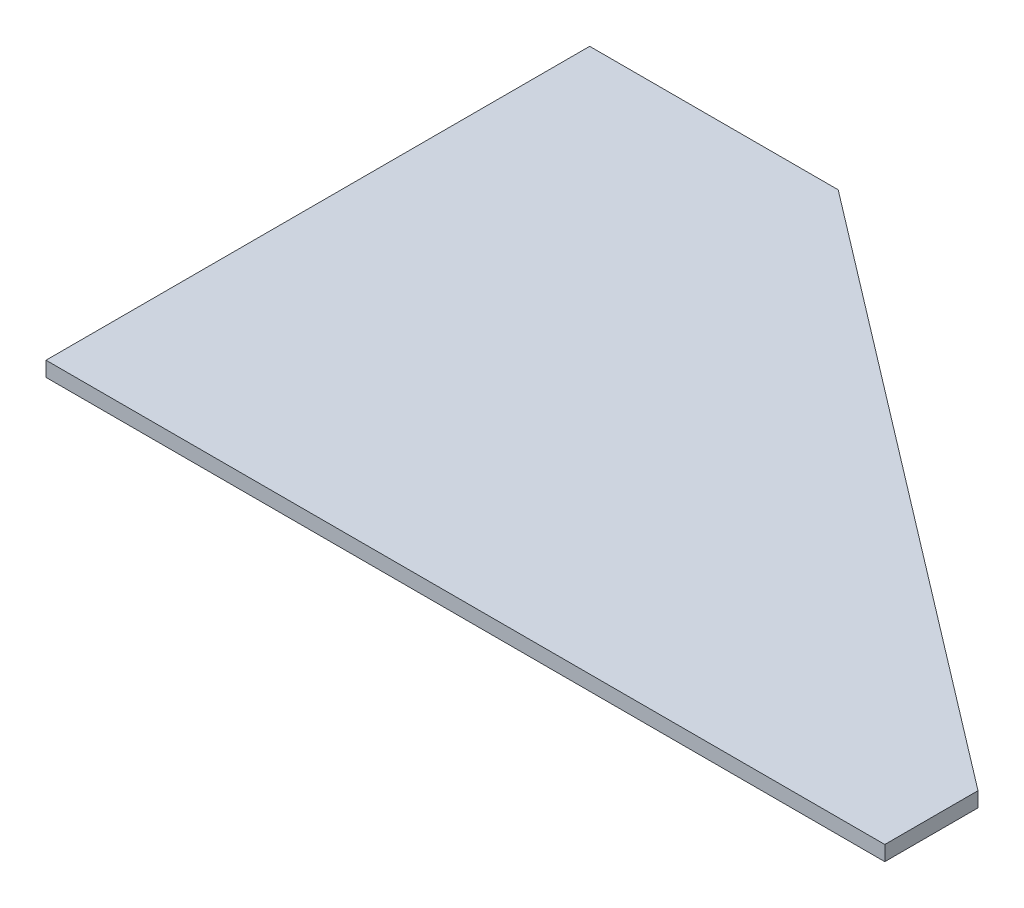
ISO-10303-21;
HEADER;
FILE_DESCRIPTION(('STEP AP214'),'2;1');
FILE_NAME('part.step','',(''),(''),'','','');
FILE_SCHEMA(('AUTOMOTIVE_DESIGN { 1 0 10303 214 1 1 1 1 }'));
ENDSEC;
DATA;
#1=APPLICATION_CONTEXT('core data for automotive mechanical design processes');
#2=APPLICATION_PROTOCOL_DEFINITION('international standard','automotive_design',2000,#1);
#3=PRODUCT_CONTEXT('',#1,'mechanical');
#4=PRODUCT('Part','Part','',(#3));
#5=PRODUCT_RELATED_PRODUCT_CATEGORY('part','',(#4));
#6=PRODUCT_DEFINITION_FORMATION('','',#4);
#7=PRODUCT_DEFINITION_CONTEXT('part definition',#1,'design');
#8=PRODUCT_DEFINITION('design','',#6,#7);
#9=PRODUCT_DEFINITION_SHAPE('','',#8);
#10=(LENGTH_UNIT() NAMED_UNIT(*) SI_UNIT(.MILLI.,.METRE.));
#11=(NAMED_UNIT(*) PLANE_ANGLE_UNIT() SI_UNIT($,.RADIAN.));
#12=(NAMED_UNIT(*) SI_UNIT($,.STERADIAN.) SOLID_ANGLE_UNIT());
#13=UNCERTAINTY_MEASURE_WITH_UNIT(LENGTH_MEASURE(1.E-05),#10,'distance_accuracy_value','');
#14=(GEOMETRIC_REPRESENTATION_CONTEXT(3) GLOBAL_UNCERTAINTY_ASSIGNED_CONTEXT((#13)) GLOBAL_UNIT_ASSIGNED_CONTEXT((#10,
#11,#12)) REPRESENTATION_CONTEXT('',''));
#15=CARTESIAN_POINT('',(0.,0.,0.));
#16=DIRECTION('',(0.,0.,1.));
#17=DIRECTION('',(1.,0.,0.));
#18=AXIS2_PLACEMENT_3D('',#15,#16,#17);
#19=CARTESIAN_POINT('',(-55.,2.4,-175.));
#20=DIRECTION('',(0.,0.,1.));
#21=DIRECTION('',(1.,0.,0.));
#22=AXIS2_PLACEMENT_3D('',#19,#20,#21);
#23=PLANE('',#22);
#24=DIRECTION('',(-1.,0.,0.));
#25=VECTOR('',#24,1.);
#26=CARTESIAN_POINT('',(-55.,-2.4,-175.));
#27=LINE('',#26,#25);
#28=CARTESIAN_POINT('',(-55.,-2.4,-175.));
#29=VERTEX_POINT('',#28);
#30=CARTESIAN_POINT('',(-135.,-2.4,-175.));
#31=VERTEX_POINT('',#30);
#32=EDGE_CURVE('E121',#29,#31,#27,.T.);
#33=ORIENTED_EDGE('',*,*,#32,.T.);
#34=DIRECTION('',(0.,-1.,0.));
#35=VECTOR('',#34,1.);
#36=CARTESIAN_POINT('',(-135.,2.4,-175.));
#37=LINE('',#36,#35);
#38=CARTESIAN_POINT('',(-135.,2.4,-175.));
#39=VERTEX_POINT('',#38);
#40=EDGE_CURVE('E11',#39,#31,#37,.T.);
#41=ORIENTED_EDGE('',*,*,#40,.F.);
#42=DIRECTION('',(-1.,0.,0.));
#43=VECTOR('',#42,1.);
#44=CARTESIAN_POINT('',(-55.,2.4,-175.));
#45=LINE('',#44,#43);
#46=CARTESIAN_POINT('',(-55.,2.4,-175.));
#47=VERTEX_POINT('',#46);
#48=EDGE_CURVE('E134',#47,#39,#45,.T.);
#49=ORIENTED_EDGE('',*,*,#48,.F.);
#50=DIRECTION('',(0.,-1.,0.));
#51=VECTOR('',#50,1.);
#52=CARTESIAN_POINT('',(-55.,2.4,-175.));
#53=LINE('',#52,#51);
#54=EDGE_CURVE('E117',#47,#29,#53,.T.);
#55=ORIENTED_EDGE('',*,*,#54,.T.);
#56=EDGE_LOOP('',(#33,#41,#49,#55));
#57=FACE_BOUND('',#56,.T.);
#58=ADVANCED_FACE('F42',(#57),#23,.F.);
#59=CARTESIAN_POINT('',(-135.,2.4,-175.));
#60=DIRECTION('',(1.,0.,0.));
#61=DIRECTION('',(0.,0.,-1.));
#62=AXIS2_PLACEMENT_3D('',#59,#60,#61);
#63=PLANE('',#62);
#64=DIRECTION('',(0.,0.,1.));
#65=VECTOR('',#64,1.);
#66=CARTESIAN_POINT('',(-135.,-2.4,-175.));
#67=LINE('',#66,#65);
#68=CARTESIAN_POINT('',(-135.,-2.4,0.));
#69=VERTEX_POINT('',#68);
#70=EDGE_CURVE('E125',#31,#69,#67,.T.);
#71=ORIENTED_EDGE('',*,*,#70,.T.);
#72=DIRECTION('',(0.,-1.,0.));
#73=VECTOR('',#72,1.);
#74=CARTESIAN_POINT('',(-135.,2.4,0.));
#75=LINE('',#74,#73);
#76=CARTESIAN_POINT('',(-135.,2.4,0.));
#77=VERTEX_POINT('',#76);
#78=EDGE_CURVE('E51',#77,#69,#75,.T.);
#79=ORIENTED_EDGE('',*,*,#78,.F.);
#80=DIRECTION('',(0.,0.,1.));
#81=VECTOR('',#80,1.);
#82=CARTESIAN_POINT('',(-135.,2.4,-175.));
#83=LINE('',#82,#81);
#84=EDGE_CURVE('E93',#39,#77,#83,.T.);
#85=ORIENTED_EDGE('',*,*,#84,.F.);
#86=ORIENTED_EDGE('',*,*,#40,.T.);
#87=EDGE_LOOP('',(#71,#79,#85,#86));
#88=FACE_BOUND('',#87,.T.);
#89=ADVANCED_FACE('F156',(#88),#63,.F.);
#90=CARTESIAN_POINT('',(-135.,2.4,0.));
#91=DIRECTION('',(0.,0.,-1.));
#92=DIRECTION('',(-1.,0.,0.));
#93=AXIS2_PLACEMENT_3D('',#90,#91,#92);
#94=PLANE('',#93);
#95=DIRECTION('',(1.,0.,0.));
#96=VECTOR('',#95,1.);
#97=CARTESIAN_POINT('',(-135.,-2.4,0.));
#98=LINE('',#97,#96);
#99=CARTESIAN_POINT('',(135.,-2.4,0.));
#100=VERTEX_POINT('',#99);
#101=EDGE_CURVE('E109',#69,#100,#98,.T.);
#102=ORIENTED_EDGE('',*,*,#101,.T.);
#103=DIRECTION('',(0.,-1.,0.));
#104=VECTOR('',#103,1.);
#105=CARTESIAN_POINT('',(135.,2.4,0.));
#106=LINE('',#105,#104);
#107=CARTESIAN_POINT('',(135.,2.4,0.));
#108=VERTEX_POINT('',#107);
#109=EDGE_CURVE('E106',#108,#100,#106,.T.);
#110=ORIENTED_EDGE('',*,*,#109,.F.);
#111=DIRECTION('',(1.,0.,0.));
#112=VECTOR('',#111,1.);
#113=CARTESIAN_POINT('',(-135.,2.4,0.));
#114=LINE('',#113,#112);
#115=EDGE_CURVE('E97',#77,#108,#114,.T.);
#116=ORIENTED_EDGE('',*,*,#115,.F.);
#117=ORIENTED_EDGE('',*,*,#78,.T.);
#118=EDGE_LOOP('',(#102,#110,#116,#117));
#119=FACE_BOUND('',#118,.T.);
#120=ADVANCED_FACE('F107',(#119),#94,.F.);
#121=CARTESIAN_POINT('',(135.,2.4,0.));
#122=DIRECTION('',(-1.,0.,0.));
#123=DIRECTION('',(0.,0.,1.));
#124=AXIS2_PLACEMENT_3D('',#121,#122,#123);
#125=PLANE('',#124);
#126=DIRECTION('',(0.,0.,-1.));
#127=VECTOR('',#126,1.);
#128=CARTESIAN_POINT('',(135.,-2.4,0.));
#129=LINE('',#128,#127);
#130=CARTESIAN_POINT('',(135.,-2.4,-30.));
#131=VERTEX_POINT('',#130);
#132=EDGE_CURVE('E79',#100,#131,#129,.T.);
#133=ORIENTED_EDGE('',*,*,#132,.T.);
#134=DIRECTION('',(0.,-1.,0.));
#135=VECTOR('',#134,1.);
#136=CARTESIAN_POINT('',(135.,2.4,-30.));
#137=LINE('',#136,#135);
#138=CARTESIAN_POINT('',(135.,2.4,-30.));
#139=VERTEX_POINT('',#138);
#140=EDGE_CURVE('E111',#139,#131,#137,.T.);
#141=ORIENTED_EDGE('',*,*,#140,.F.);
#142=DIRECTION('',(0.,0.,-1.));
#143=VECTOR('',#142,1.);
#144=CARTESIAN_POINT('',(135.,2.4,0.));
#145=LINE('',#144,#143);
#146=EDGE_CURVE('E101',#108,#139,#145,.T.);
#147=ORIENTED_EDGE('',*,*,#146,.F.);
#148=ORIENTED_EDGE('',*,*,#109,.T.);
#149=EDGE_LOOP('',(#133,#141,#147,#148));
#150=FACE_BOUND('',#149,.T.);
#151=ADVANCED_FACE('F113',(#150),#125,.F.);
#152=CARTESIAN_POINT('',(135.,2.4,-30.));
#153=DIRECTION('',(-0.606673319350191,0.,0.794951246045077));
#154=DIRECTION('',(0.794951246045078,0.,0.606673319350191));
#155=AXIS2_PLACEMENT_3D('',#152,#153,#154);
#156=PLANE('',#155);
#157=DIRECTION('',(-0.794951246045077,0.,-0.606673319350191));
#158=VECTOR('',#157,1.);
#159=CARTESIAN_POINT('',(135.,-2.4,-30.));
#160=LINE('',#159,#158);
#161=EDGE_CURVE('E85',#131,#29,#160,.T.);
#162=ORIENTED_EDGE('',*,*,#161,.T.);
#163=ORIENTED_EDGE('',*,*,#54,.F.);
#164=DIRECTION('',(-0.794951246045077,0.,-0.606673319350191));
#165=VECTOR('',#164,1.);
#166=CARTESIAN_POINT('',(135.,2.4,-30.));
#167=LINE('',#166,#165);
#168=EDGE_CURVE('E59',#139,#47,#167,.T.);
#169=ORIENTED_EDGE('',*,*,#168,.F.);
#170=ORIENTED_EDGE('',*,*,#140,.T.);
#171=EDGE_LOOP('',(#162,#163,#169,#170));
#172=FACE_BOUND('',#171,.T.);
#173=ADVANCED_FACE('F145',(#172),#156,.F.);
#174=CARTESIAN_POINT('',(0.,2.4,0.));
#175=DIRECTION('',(0.,1.,0.));
#176=DIRECTION('',(0.,0.,1.));
#177=AXIS2_PLACEMENT_3D('',#174,#175,#176);
#178=PLANE('',#177);
#179=ORIENTED_EDGE('',*,*,#48,.T.);
#180=ORIENTED_EDGE('',*,*,#84,.T.);
#181=ORIENTED_EDGE('',*,*,#115,.T.);
#182=ORIENTED_EDGE('',*,*,#146,.T.);
#183=ORIENTED_EDGE('',*,*,#168,.T.);
#184=EDGE_LOOP('',(#179,#180,#181,#182,#183));
#185=FACE_BOUND('',#184,.T.);
#186=ADVANCED_FACE('F99',(#185),#178,.T.);
#187=CARTESIAN_POINT('',(0.,-2.4,0.));
#188=DIRECTION('',(0.,1.,0.));
#189=DIRECTION('',(0.,0.,1.));
#190=AXIS2_PLACEMENT_3D('',#187,#188,#189);
#191=PLANE('',#190);
#192=ORIENTED_EDGE('',*,*,#32,.F.);
#193=ORIENTED_EDGE('',*,*,#161,.F.);
#194=ORIENTED_EDGE('',*,*,#132,.F.);
#195=ORIENTED_EDGE('',*,*,#101,.F.);
#196=ORIENTED_EDGE('',*,*,#70,.F.);
#197=EDGE_LOOP('',(#192,#193,#194,#195,#196));
#198=FACE_BOUND('',#197,.T.);
#199=ADVANCED_FACE('F141',(#198),#191,.F.);
#200=CLOSED_SHELL('',(#58,#89,#120,#151,#173,#186,#199));
#201=MANIFOLD_SOLID_BREP('B2',#200);
#202=ADVANCED_BREP_SHAPE_REPRESENTATION('',(#18,#201),#14);
#203=SHAPE_DEFINITION_REPRESENTATION(#9,#202);
ENDSEC;
END-ISO-10303-21;
